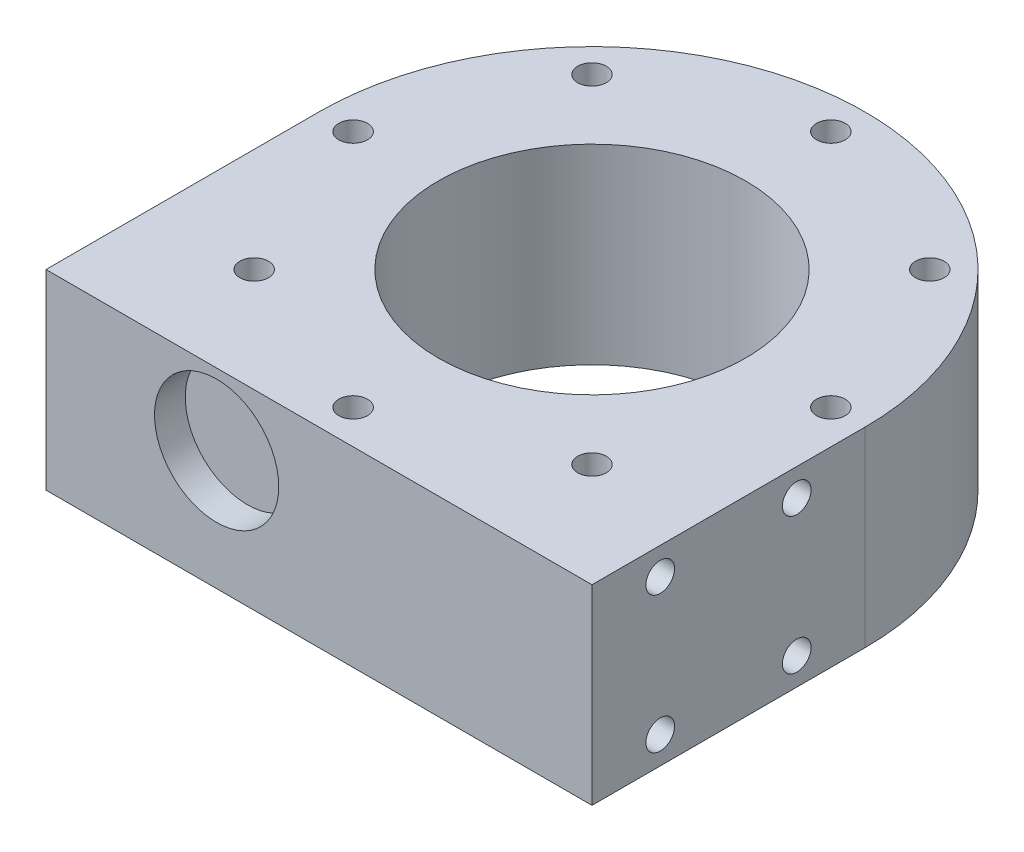
ISO-10303-21;
HEADER;
FILE_DESCRIPTION(('STEP AP214'),'2;1');
FILE_NAME('part.step','',(''),(''),'','','');
FILE_SCHEMA(('AUTOMOTIVE_DESIGN { 1 0 10303 214 1 1 1 1 }'));
ENDSEC;
DATA;
#1=APPLICATION_CONTEXT('core data for automotive mechanical design processes');
#2=APPLICATION_PROTOCOL_DEFINITION('international standard','automotive_design',2000,#1);
#3=PRODUCT_CONTEXT('',#1,'mechanical');
#4=PRODUCT('Part','Part','',(#3));
#5=PRODUCT_RELATED_PRODUCT_CATEGORY('part','',(#4));
#6=PRODUCT_DEFINITION_FORMATION('','',#4);
#7=PRODUCT_DEFINITION_CONTEXT('part definition',#1,'design');
#8=PRODUCT_DEFINITION('design','',#6,#7);
#9=PRODUCT_DEFINITION_SHAPE('','',#8);
#10=(LENGTH_UNIT() NAMED_UNIT(*) SI_UNIT(.MILLI.,.METRE.));
#11=(NAMED_UNIT(*) PLANE_ANGLE_UNIT() SI_UNIT($,.RADIAN.));
#12=(NAMED_UNIT(*) SI_UNIT($,.STERADIAN.) SOLID_ANGLE_UNIT());
#13=UNCERTAINTY_MEASURE_WITH_UNIT(LENGTH_MEASURE(1.E-05),#10,'distance_accuracy_value','');
#14=(GEOMETRIC_REPRESENTATION_CONTEXT(3) GLOBAL_UNCERTAINTY_ASSIGNED_CONTEXT((#13)) GLOBAL_UNIT_ASSIGNED_CONTEXT((#10,
#11,#12)) REPRESENTATION_CONTEXT('',''));
#15=CARTESIAN_POINT('',(0.,0.,0.));
#16=DIRECTION('',(0.,0.,1.));
#17=DIRECTION('',(1.,0.,0.));
#18=AXIS2_PLACEMENT_3D('',#15,#16,#17);
#19=CARTESIAN_POINT('',(0.,28.,0.));
#20=DIRECTION('',(0.,1.,0.));
#21=DIRECTION('',(0.,0.,1.));
#22=AXIS2_PLACEMENT_3D('',#19,#20,#21);
#23=PLANE('',#22);
#24=CARTESIAN_POINT('',(0.,28.,-35.));
#25=DIRECTION('',(0.,1.,0.));
#26=DIRECTION('',(0.,0.,1.));
#27=AXIS2_PLACEMENT_3D('',#24,#25,#26);
#28=CIRCLE('',#27,2.1);
#29=CARTESIAN_POINT('',(0.,28.,-32.9));
#30=VERTEX_POINT('',#29);
#31=EDGE_CURVE('E198',#30,#30,#28,.T.);
#32=ORIENTED_EDGE('',*,*,#31,.F.);
#33=EDGE_LOOP('',(#32));
#34=FACE_BOUND('',#33,.T.);
#35=CARTESIAN_POINT('',(24.7487373415292,28.,-24.7487373415292));
#36=DIRECTION('',(0.,1.,0.));
#37=DIRECTION('',(0.,0.,1.));
#38=AXIS2_PLACEMENT_3D('',#35,#36,#37);
#39=CIRCLE('',#38,2.1);
#40=CARTESIAN_POINT('',(24.7487373415292,28.,-22.6487373415292));
#41=VERTEX_POINT('',#40);
#42=EDGE_CURVE('E194',#41,#41,#39,.T.);
#43=ORIENTED_EDGE('',*,*,#42,.F.);
#44=EDGE_LOOP('',(#43));
#45=FACE_BOUND('',#44,.T.);
#46=CARTESIAN_POINT('',(35.,28.,0.));
#47=DIRECTION('',(0.,1.,0.));
#48=DIRECTION('',(0.,0.,1.));
#49=AXIS2_PLACEMENT_3D('',#46,#47,#48);
#50=CIRCLE('',#49,2.1);
#51=CARTESIAN_POINT('',(35.,28.,2.1));
#52=VERTEX_POINT('',#51);
#53=EDGE_CURVE('E186',#52,#52,#50,.T.);
#54=ORIENTED_EDGE('',*,*,#53,.F.);
#55=EDGE_LOOP('',(#54));
#56=FACE_BOUND('',#55,.T.);
#57=CARTESIAN_POINT('',(24.7487373415292,28.,24.7487373415292));
#58=DIRECTION('',(0.,1.,0.));
#59=DIRECTION('',(0.,0.,1.));
#60=AXIS2_PLACEMENT_3D('',#57,#58,#59);
#61=CIRCLE('',#60,2.1);
#62=CARTESIAN_POINT('',(24.7487373415292,28.,26.8487373415292));
#63=VERTEX_POINT('',#62);
#64=EDGE_CURVE('E178',#63,#63,#61,.T.);
#65=ORIENTED_EDGE('',*,*,#64,.F.);
#66=EDGE_LOOP('',(#65));
#67=FACE_BOUND('',#66,.T.);
#68=CARTESIAN_POINT('',(0.,28.,35.));
#69=DIRECTION('',(0.,1.,0.));
#70=DIRECTION('',(0.,0.,1.));
#71=AXIS2_PLACEMENT_3D('',#68,#69,#70);
#72=CIRCLE('',#71,2.1);
#73=CARTESIAN_POINT('',(0.,28.,37.1));
#74=VERTEX_POINT('',#73);
#75=EDGE_CURVE('E170',#74,#74,#72,.T.);
#76=ORIENTED_EDGE('',*,*,#75,.F.);
#77=EDGE_LOOP('',(#76));
#78=FACE_BOUND('',#77,.T.);
#79=CARTESIAN_POINT('',(-24.7487373415292,28.,24.7487373415292));
#80=DIRECTION('',(0.,1.,0.));
#81=DIRECTION('',(0.,0.,1.));
#82=AXIS2_PLACEMENT_3D('',#79,#80,#81);
#83=CIRCLE('',#82,2.1);
#84=CARTESIAN_POINT('',(-24.7487373415292,28.,26.8487373415292));
#85=VERTEX_POINT('',#84);
#86=EDGE_CURVE('E162',#85,#85,#83,.T.);
#87=ORIENTED_EDGE('',*,*,#86,.F.);
#88=EDGE_LOOP('',(#87));
#89=FACE_BOUND('',#88,.T.);
#90=CARTESIAN_POINT('',(-35.,28.,0.));
#91=DIRECTION('',(0.,1.,0.));
#92=DIRECTION('',(0.,0.,1.));
#93=AXIS2_PLACEMENT_3D('',#90,#91,#92);
#94=CIRCLE('',#93,2.1);
#95=CARTESIAN_POINT('',(-35.,28.,2.1));
#96=VERTEX_POINT('',#95);
#97=EDGE_CURVE('E154',#96,#96,#94,.T.);
#98=ORIENTED_EDGE('',*,*,#97,.F.);
#99=EDGE_LOOP('',(#98));
#100=FACE_BOUND('',#99,.T.);
#101=CARTESIAN_POINT('',(-24.7487373415292,28.,-24.7487373415292));
#102=DIRECTION('',(0.,1.,0.));
#103=DIRECTION('',(0.,0.,1.));
#104=AXIS2_PLACEMENT_3D('',#101,#102,#103);
#105=CIRCLE('',#104,2.1);
#106=CARTESIAN_POINT('',(-24.7487373415292,28.,-22.6487373415292));
#107=VERTEX_POINT('',#106);
#108=EDGE_CURVE('E145',#107,#107,#105,.T.);
#109=ORIENTED_EDGE('',*,*,#108,.F.);
#110=EDGE_LOOP('',(#109));
#111=FACE_BOUND('',#110,.T.);
#112=CARTESIAN_POINT('',(0.,28.,0.));
#113=DIRECTION('',(0.,1.,0.));
#114=DIRECTION('',(0.,0.,1.));
#115=AXIS2_PLACEMENT_3D('',#112,#113,#114);
#116=CIRCLE('',#115,40.);
#117=CARTESIAN_POINT('',(40.,28.,0.));
#118=VERTEX_POINT('',#117);
#119=CARTESIAN_POINT('',(-40.,28.,0.));
#120=VERTEX_POINT('',#119);
#121=EDGE_CURVE('E95',#118,#120,#116,.T.);
#122=ORIENTED_EDGE('',*,*,#121,.T.);
#123=DIRECTION('',(0.,0.,1.));
#124=VECTOR('',#123,1.);
#125=CARTESIAN_POINT('',(-40.,28.,0.));
#126=LINE('',#125,#124);
#127=CARTESIAN_POINT('',(-40.,28.,40.));
#128=VERTEX_POINT('',#127);
#129=EDGE_CURVE('E90',#120,#128,#126,.T.);
#130=ORIENTED_EDGE('',*,*,#129,.T.);
#131=DIRECTION('',(1.,0.,0.));
#132=VECTOR('',#131,1.);
#133=CARTESIAN_POINT('',(-40.,28.,40.));
#134=LINE('',#133,#132);
#135=CARTESIAN_POINT('',(40.,28.,40.));
#136=VERTEX_POINT('',#135);
#137=EDGE_CURVE('E93',#128,#136,#134,.T.);
#138=ORIENTED_EDGE('',*,*,#137,.T.);
#139=DIRECTION('',(0.,0.,-1.));
#140=VECTOR('',#139,1.);
#141=CARTESIAN_POINT('',(40.,28.,0.));
#142=LINE('',#141,#140);
#143=EDGE_CURVE('E60',#136,#118,#142,.T.);
#144=ORIENTED_EDGE('',*,*,#143,.T.);
#145=EDGE_LOOP('',(#122,#130,#138,#144));
#146=FACE_BOUND('',#145,.T.);
#147=CARTESIAN_POINT('',(0.,28.,0.));
#148=DIRECTION('',(0.,1.,0.));
#149=DIRECTION('',(0.,0.,1.));
#150=AXIS2_PLACEMENT_3D('',#147,#148,#149);
#151=CIRCLE('',#150,22.5);
#152=CARTESIAN_POINT('',(0.,28.,22.5));
#153=VERTEX_POINT('',#152);
#154=EDGE_CURVE('E115',#153,#153,#151,.T.);
#155=ORIENTED_EDGE('',*,*,#154,.F.);
#156=EDGE_LOOP('',(#155));
#157=FACE_BOUND('',#156,.T.);
#158=ADVANCED_FACE('F42',(#34,#45,#56,#67,#78,#89,#100,#111,#146,#157),#23,.T.);
#159=CARTESIAN_POINT('',(0.,0.,0.));
#160=DIRECTION('',(0.,1.,0.));
#161=DIRECTION('',(0.,0.,1.));
#162=AXIS2_PLACEMENT_3D('',#159,#160,#161);
#163=PLANE('',#162);
#164=CARTESIAN_POINT('',(0.,0.,-35.));
#165=DIRECTION('',(0.,1.,0.));
#166=DIRECTION('',(0.,0.,1.));
#167=AXIS2_PLACEMENT_3D('',#164,#165,#166);
#168=CIRCLE('',#167,2.1);
#169=CARTESIAN_POINT('',(0.,0.,-32.9));
#170=VERTEX_POINT('',#169);
#171=EDGE_CURVE('E137',#170,#170,#168,.T.);
#172=ORIENTED_EDGE('',*,*,#171,.T.);
#173=EDGE_LOOP('',(#172));
#174=FACE_BOUND('',#173,.T.);
#175=CARTESIAN_POINT('',(24.7487373415292,0.,-24.7487373415292));
#176=DIRECTION('',(0.,1.,0.));
#177=DIRECTION('',(0.,0.,1.));
#178=AXIS2_PLACEMENT_3D('',#175,#176,#177);
#179=CIRCLE('',#178,2.1);
#180=CARTESIAN_POINT('',(24.7487373415292,0.,-22.6487373415292));
#181=VERTEX_POINT('',#180);
#182=EDGE_CURVE('E190',#181,#181,#179,.T.);
#183=ORIENTED_EDGE('',*,*,#182,.T.);
#184=EDGE_LOOP('',(#183));
#185=FACE_BOUND('',#184,.T.);
#186=CARTESIAN_POINT('',(35.,0.,0.));
#187=DIRECTION('',(0.,1.,0.));
#188=DIRECTION('',(0.,0.,1.));
#189=AXIS2_PLACEMENT_3D('',#186,#187,#188);
#190=CIRCLE('',#189,2.1);
#191=CARTESIAN_POINT('',(35.,0.,2.1));
#192=VERTEX_POINT('',#191);
#193=EDGE_CURVE('E182',#192,#192,#190,.T.);
#194=ORIENTED_EDGE('',*,*,#193,.T.);
#195=EDGE_LOOP('',(#194));
#196=FACE_BOUND('',#195,.T.);
#197=CARTESIAN_POINT('',(24.7487373415292,0.,24.7487373415292));
#198=DIRECTION('',(0.,1.,0.));
#199=DIRECTION('',(0.,0.,1.));
#200=AXIS2_PLACEMENT_3D('',#197,#198,#199);
#201=CIRCLE('',#200,2.1);
#202=CARTESIAN_POINT('',(24.7487373415292,0.,26.8487373415292));
#203=VERTEX_POINT('',#202);
#204=EDGE_CURVE('E174',#203,#203,#201,.T.);
#205=ORIENTED_EDGE('',*,*,#204,.T.);
#206=EDGE_LOOP('',(#205));
#207=FACE_BOUND('',#206,.T.);
#208=CARTESIAN_POINT('',(0.,0.,35.));
#209=DIRECTION('',(0.,1.,0.));
#210=DIRECTION('',(0.,0.,1.));
#211=AXIS2_PLACEMENT_3D('',#208,#209,#210);
#212=CIRCLE('',#211,2.1);
#213=CARTESIAN_POINT('',(0.,0.,37.1));
#214=VERTEX_POINT('',#213);
#215=EDGE_CURVE('E166',#214,#214,#212,.T.);
#216=ORIENTED_EDGE('',*,*,#215,.T.);
#217=EDGE_LOOP('',(#216));
#218=FACE_BOUND('',#217,.T.);
#219=CARTESIAN_POINT('',(-24.7487373415292,0.,24.7487373415292));
#220=DIRECTION('',(0.,1.,0.));
#221=DIRECTION('',(0.,0.,1.));
#222=AXIS2_PLACEMENT_3D('',#219,#220,#221);
#223=CIRCLE('',#222,2.1);
#224=CARTESIAN_POINT('',(-24.7487373415292,0.,26.8487373415292));
#225=VERTEX_POINT('',#224);
#226=EDGE_CURVE('E158',#225,#225,#223,.T.);
#227=ORIENTED_EDGE('',*,*,#226,.T.);
#228=EDGE_LOOP('',(#227));
#229=FACE_BOUND('',#228,.T.);
#230=CARTESIAN_POINT('',(-35.,0.,0.));
#231=DIRECTION('',(0.,1.,0.));
#232=DIRECTION('',(0.,0.,1.));
#233=AXIS2_PLACEMENT_3D('',#230,#231,#232);
#234=CIRCLE('',#233,2.1);
#235=CARTESIAN_POINT('',(-35.,0.,2.1));
#236=VERTEX_POINT('',#235);
#237=EDGE_CURVE('E150',#236,#236,#234,.T.);
#238=ORIENTED_EDGE('',*,*,#237,.T.);
#239=EDGE_LOOP('',(#238));
#240=FACE_BOUND('',#239,.T.);
#241=CARTESIAN_POINT('',(-24.7487373415292,0.,-24.7487373415292));
#242=DIRECTION('',(0.,1.,0.));
#243=DIRECTION('',(0.,0.,1.));
#244=AXIS2_PLACEMENT_3D('',#241,#242,#243);
#245=CIRCLE('',#244,2.1);
#246=CARTESIAN_POINT('',(-24.7487373415292,0.,-22.6487373415292));
#247=VERTEX_POINT('',#246);
#248=EDGE_CURVE('E141',#247,#247,#245,.T.);
#249=ORIENTED_EDGE('',*,*,#248,.T.);
#250=EDGE_LOOP('',(#249));
#251=FACE_BOUND('',#250,.T.);
#252=CARTESIAN_POINT('',(0.,0.,0.));
#253=DIRECTION('',(0.,1.,0.));
#254=DIRECTION('',(0.,0.,1.));
#255=AXIS2_PLACEMENT_3D('',#252,#253,#254);
#256=CIRCLE('',#255,40.);
#257=CARTESIAN_POINT('',(40.,0.,0.));
#258=VERTEX_POINT('',#257);
#259=CARTESIAN_POINT('',(-40.,0.,0.));
#260=VERTEX_POINT('',#259);
#261=EDGE_CURVE('E111',#258,#260,#256,.T.);
#262=ORIENTED_EDGE('',*,*,#261,.F.);
#263=DIRECTION('',(0.,0.,-1.));
#264=VECTOR('',#263,1.);
#265=CARTESIAN_POINT('',(40.,0.,0.));
#266=LINE('',#265,#264);
#267=CARTESIAN_POINT('',(40.,0.,40.));
#268=VERTEX_POINT('',#267);
#269=EDGE_CURVE('E83',#268,#258,#266,.T.);
#270=ORIENTED_EDGE('',*,*,#269,.F.);
#271=DIRECTION('',(1.,0.,0.));
#272=VECTOR('',#271,1.);
#273=CARTESIAN_POINT('',(-40.,0.,40.));
#274=LINE('',#273,#272);
#275=CARTESIAN_POINT('',(-40.,0.,40.));
#276=VERTEX_POINT('',#275);
#277=EDGE_CURVE('E77',#276,#268,#274,.T.);
#278=ORIENTED_EDGE('',*,*,#277,.F.);
#279=DIRECTION('',(0.,0.,1.));
#280=VECTOR('',#279,1.);
#281=CARTESIAN_POINT('',(-40.,0.,0.));
#282=LINE('',#281,#280);
#283=EDGE_CURVE('E100',#260,#276,#282,.T.);
#284=ORIENTED_EDGE('',*,*,#283,.F.);
#285=EDGE_LOOP('',(#262,#270,#278,#284));
#286=FACE_BOUND('',#285,.T.);
#287=CARTESIAN_POINT('',(0.,0.,0.));
#288=DIRECTION('',(0.,1.,0.));
#289=DIRECTION('',(0.,0.,1.));
#290=AXIS2_PLACEMENT_3D('',#287,#288,#289);
#291=CIRCLE('',#290,22.5);
#292=CARTESIAN_POINT('',(0.,0.,22.5));
#293=VERTEX_POINT('',#292);
#294=EDGE_CURVE('E133',#293,#293,#291,.T.);
#295=ORIENTED_EDGE('',*,*,#294,.T.);
#296=EDGE_LOOP('',(#295));
#297=FACE_BOUND('',#296,.T.);
#298=ADVANCED_FACE('F128',(#174,#185,#196,#207,#218,#229,#240,#251,#286,#297),#163,.F.);
#299=CARTESIAN_POINT('',(0.,28.,0.));
#300=DIRECTION('',(0.,-1.,0.));
#301=DIRECTION('',(0.,0.,-1.));
#302=AXIS2_PLACEMENT_3D('',#299,#300,#301);
#303=CYLINDRICAL_SURFACE('',#302,40.);
#304=ORIENTED_EDGE('',*,*,#261,.T.);
#305=DIRECTION('',(0.,-1.,0.));
#306=VECTOR('',#305,1.);
#307=CARTESIAN_POINT('',(-40.,28.,0.));
#308=LINE('',#307,#306);
#309=EDGE_CURVE('E11',#120,#260,#308,.T.);
#310=ORIENTED_EDGE('',*,*,#309,.F.);
#311=ORIENTED_EDGE('',*,*,#121,.F.);
#312=DIRECTION('',(0.,-1.,0.));
#313=VECTOR('',#312,1.);
#314=CARTESIAN_POINT('',(40.,28.,0.));
#315=LINE('',#314,#313);
#316=EDGE_CURVE('E107',#118,#258,#315,.T.);
#317=ORIENTED_EDGE('',*,*,#316,.T.);
#318=EDGE_LOOP('',(#304,#310,#311,#317));
#319=FACE_BOUND('',#318,.T.);
#320=ADVANCED_FACE('F44',(#319),#303,.T.);
#321=CARTESIAN_POINT('',(-40.,28.,0.));
#322=DIRECTION('',(1.,0.,0.));
#323=DIRECTION('',(0.,0.,-1.));
#324=AXIS2_PLACEMENT_3D('',#321,#322,#323);
#325=PLANE('',#324);
#326=CARTESIAN_POINT('',(-40.,24.,30.));
#327=DIRECTION('',(-1.,0.,0.));
#328=DIRECTION('',(0.,0.,1.));
#329=AXIS2_PLACEMENT_3D('',#326,#327,#328);
#330=CIRCLE('',#329,2.1);
#331=CARTESIAN_POINT('',(-40.,24.,32.1));
#332=VERTEX_POINT('',#331);
#333=EDGE_CURVE('E217',#332,#332,#330,.T.);
#334=ORIENTED_EDGE('',*,*,#333,.F.);
#335=EDGE_LOOP('',(#334));
#336=FACE_BOUND('',#335,.T.);
#337=CARTESIAN_POINT('',(-40.,4.,10.));
#338=DIRECTION('',(-1.,0.,0.));
#339=DIRECTION('',(0.,0.,1.));
#340=AXIS2_PLACEMENT_3D('',#337,#338,#339);
#341=CIRCLE('',#340,2.1);
#342=CARTESIAN_POINT('',(-40.,4.,12.1));
#343=VERTEX_POINT('',#342);
#344=EDGE_CURVE('E225',#343,#343,#341,.T.);
#345=ORIENTED_EDGE('',*,*,#344,.F.);
#346=EDGE_LOOP('',(#345));
#347=FACE_BOUND('',#346,.T.);
#348=CARTESIAN_POINT('',(-40.,4.,30.));
#349=DIRECTION('',(-1.,0.,0.));
#350=DIRECTION('',(0.,0.,1.));
#351=AXIS2_PLACEMENT_3D('',#348,#349,#350);
#352=CIRCLE('',#351,2.1);
#353=CARTESIAN_POINT('',(-40.,4.,32.1));
#354=VERTEX_POINT('',#353);
#355=EDGE_CURVE('E226',#354,#354,#352,.T.);
#356=ORIENTED_EDGE('',*,*,#355,.F.);
#357=EDGE_LOOP('',(#356));
#358=FACE_BOUND('',#357,.T.);
#359=CARTESIAN_POINT('',(-40.,24.,9.99999999999999));
#360=DIRECTION('',(-1.,0.,0.));
#361=DIRECTION('',(0.,0.,1.));
#362=AXIS2_PLACEMENT_3D('',#359,#360,#361);
#363=CIRCLE('',#362,2.1);
#364=CARTESIAN_POINT('',(-40.,24.,12.1));
#365=VERTEX_POINT('',#364);
#366=EDGE_CURVE('E213',#365,#365,#363,.T.);
#367=ORIENTED_EDGE('',*,*,#366,.F.);
#368=EDGE_LOOP('',(#367));
#369=FACE_BOUND('',#368,.T.);
#370=ORIENTED_EDGE('',*,*,#283,.T.);
#371=DIRECTION('',(0.,-1.,0.));
#372=VECTOR('',#371,1.);
#373=CARTESIAN_POINT('',(-40.,28.,40.));
#374=LINE('',#373,#372);
#375=EDGE_CURVE('E52',#128,#276,#374,.T.);
#376=ORIENTED_EDGE('',*,*,#375,.F.);
#377=ORIENTED_EDGE('',*,*,#129,.F.);
#378=ORIENTED_EDGE('',*,*,#309,.T.);
#379=EDGE_LOOP('',(#370,#376,#377,#378));
#380=FACE_BOUND('',#379,.T.);
#381=ADVANCED_FACE('F99',(#336,#347,#358,#369,#380),#325,.F.);
#382=CARTESIAN_POINT('',(-40.,28.,40.));
#383=DIRECTION('',(0.,0.,-1.));
#384=DIRECTION('',(-1.,0.,0.));
#385=AXIS2_PLACEMENT_3D('',#382,#383,#384);
#386=PLANE('',#385);
#387=CARTESIAN_POINT('',(-15.,17.5,40.));
#388=DIRECTION('',(0.,0.,1.));
#389=DIRECTION('',(1.,0.,0.));
#390=AXIS2_PLACEMENT_3D('',#387,#388,#389);
#391=CIRCLE('',#390,9.1);
#392=CARTESIAN_POINT('',(-5.89999999999999,17.5,40.));
#393=VERTEX_POINT('',#392);
#394=EDGE_CURVE('E205',#393,#393,#391,.T.);
#395=ORIENTED_EDGE('',*,*,#394,.F.);
#396=EDGE_LOOP('',(#395));
#397=FACE_BOUND('',#396,.T.);
#398=ORIENTED_EDGE('',*,*,#277,.T.);
#399=DIRECTION('',(0.,-1.,0.));
#400=VECTOR('',#399,1.);
#401=CARTESIAN_POINT('',(40.,28.,40.));
#402=LINE('',#401,#400);
#403=EDGE_CURVE('E102',#136,#268,#402,.T.);
#404=ORIENTED_EDGE('',*,*,#403,.F.);
#405=ORIENTED_EDGE('',*,*,#137,.F.);
#406=ORIENTED_EDGE('',*,*,#375,.T.);
#407=EDGE_LOOP('',(#398,#404,#405,#406));
#408=FACE_BOUND('',#407,.T.);
#409=ADVANCED_FACE('F103',(#397,#408),#386,.F.);
#410=CARTESIAN_POINT('',(40.,28.,0.));
#411=DIRECTION('',(-1.,0.,0.));
#412=DIRECTION('',(0.,0.,1.));
#413=AXIS2_PLACEMENT_3D('',#410,#411,#412);
#414=PLANE('',#413);
#415=CARTESIAN_POINT('',(40.,24.,30.));
#416=DIRECTION('',(-1.,0.,0.));
#417=DIRECTION('',(0.,0.,1.));
#418=AXIS2_PLACEMENT_3D('',#415,#416,#417);
#419=CIRCLE('',#418,2.1);
#420=CARTESIAN_POINT('',(40.,24.,32.1));
#421=VERTEX_POINT('',#420);
#422=EDGE_CURVE('E262',#421,#421,#419,.T.);
#423=ORIENTED_EDGE('',*,*,#422,.T.);
#424=EDGE_LOOP('',(#423));
#425=FACE_BOUND('',#424,.T.);
#426=CARTESIAN_POINT('',(40.,4.,10.));
#427=DIRECTION('',(-1.,0.,0.));
#428=DIRECTION('',(0.,0.,1.));
#429=AXIS2_PLACEMENT_3D('',#426,#427,#428);
#430=CIRCLE('',#429,2.1);
#431=CARTESIAN_POINT('',(40.,4.,12.1));
#432=VERTEX_POINT('',#431);
#433=EDGE_CURVE('E253',#432,#432,#430,.T.);
#434=ORIENTED_EDGE('',*,*,#433,.T.);
#435=EDGE_LOOP('',(#434));
#436=FACE_BOUND('',#435,.T.);
#437=CARTESIAN_POINT('',(40.,4.,30.));
#438=DIRECTION('',(-1.,0.,0.));
#439=DIRECTION('',(0.,0.,1.));
#440=AXIS2_PLACEMENT_3D('',#437,#438,#439);
#441=CIRCLE('',#440,2.1);
#442=CARTESIAN_POINT('',(40.,4.,32.1));
#443=VERTEX_POINT('',#442);
#444=EDGE_CURVE('E269',#443,#443,#441,.T.);
#445=ORIENTED_EDGE('',*,*,#444,.T.);
#446=EDGE_LOOP('',(#445));
#447=FACE_BOUND('',#446,.T.);
#448=CARTESIAN_POINT('',(40.,24.,9.99999999999999));
#449=DIRECTION('',(-1.,0.,0.));
#450=DIRECTION('',(0.,0.,1.));
#451=AXIS2_PLACEMENT_3D('',#448,#449,#450);
#452=CIRCLE('',#451,2.1);
#453=CARTESIAN_POINT('',(40.,24.,12.1));
#454=VERTEX_POINT('',#453);
#455=EDGE_CURVE('E245',#454,#454,#452,.T.);
#456=ORIENTED_EDGE('',*,*,#455,.T.);
#457=EDGE_LOOP('',(#456));
#458=FACE_BOUND('',#457,.T.);
#459=ORIENTED_EDGE('',*,*,#269,.T.);
#460=ORIENTED_EDGE('',*,*,#316,.F.);
#461=ORIENTED_EDGE('',*,*,#143,.F.);
#462=ORIENTED_EDGE('',*,*,#403,.T.);
#463=EDGE_LOOP('',(#459,#460,#461,#462));
#464=FACE_BOUND('',#463,.T.);
#465=ADVANCED_FACE('F125',(#425,#436,#447,#458,#464),#414,.F.);
#466=CARTESIAN_POINT('',(0.,28.,0.));
#467=DIRECTION('',(0.,-1.,0.));
#468=DIRECTION('',(0.,0.,-1.));
#469=AXIS2_PLACEMENT_3D('',#466,#467,#468);
#470=CYLINDRICAL_SURFACE('',#469,22.5);
#471=ORIENTED_EDGE('',*,*,#154,.T.);
#472=EDGE_LOOP('',(#471));
#473=FACE_BOUND('',#472,.T.);
#474=ORIENTED_EDGE('',*,*,#294,.F.);
#475=EDGE_LOOP('',(#474));
#476=FACE_BOUND('',#475,.T.);
#477=ADVANCED_FACE('F304',(#473,#476),#470,.F.);
#478=CARTESIAN_POINT('',(-24.7487373415292,0.,-24.7487373415292));
#479=DIRECTION('',(0.,1.,0.));
#480=DIRECTION('',(0.,0.,1.));
#481=AXIS2_PLACEMENT_3D('',#478,#479,#480);
#482=CYLINDRICAL_SURFACE('',#481,2.1);
#483=ORIENTED_EDGE('',*,*,#248,.F.);
#484=EDGE_LOOP('',(#483));
#485=FACE_BOUND('',#484,.T.);
#486=ORIENTED_EDGE('',*,*,#108,.T.);
#487=EDGE_LOOP('',(#486));
#488=FACE_BOUND('',#487,.T.);
#489=ADVANCED_FACE('F374',(#485,#488),#482,.F.);
#490=CARTESIAN_POINT('',(-35.,0.,0.));
#491=DIRECTION('',(0.,1.,0.));
#492=DIRECTION('',(0.,0.,1.));
#493=AXIS2_PLACEMENT_3D('',#490,#491,#492);
#494=CYLINDRICAL_SURFACE('',#493,2.1);
#495=ORIENTED_EDGE('',*,*,#237,.F.);
#496=EDGE_LOOP('',(#495));
#497=FACE_BOUND('',#496,.T.);
#498=ORIENTED_EDGE('',*,*,#97,.T.);
#499=EDGE_LOOP('',(#498));
#500=FACE_BOUND('',#499,.T.);
#501=ADVANCED_FACE('F371',(#497,#500),#494,.F.);
#502=CARTESIAN_POINT('',(-24.7487373415292,0.,24.7487373415292));
#503=DIRECTION('',(0.,1.,0.));
#504=DIRECTION('',(0.,0.,1.));
#505=AXIS2_PLACEMENT_3D('',#502,#503,#504);
#506=CYLINDRICAL_SURFACE('',#505,2.1);
#507=ORIENTED_EDGE('',*,*,#226,.F.);
#508=EDGE_LOOP('',(#507));
#509=FACE_BOUND('',#508,.T.);
#510=ORIENTED_EDGE('',*,*,#86,.T.);
#511=EDGE_LOOP('',(#510));
#512=FACE_BOUND('',#511,.T.);
#513=ADVANCED_FACE('F367',(#509,#512),#506,.F.);
#514=CARTESIAN_POINT('',(0.,0.,35.));
#515=DIRECTION('',(0.,1.,0.));
#516=DIRECTION('',(0.,0.,1.));
#517=AXIS2_PLACEMENT_3D('',#514,#515,#516);
#518=CYLINDRICAL_SURFACE('',#517,2.1);
#519=ORIENTED_EDGE('',*,*,#215,.F.);
#520=EDGE_LOOP('',(#519));
#521=FACE_BOUND('',#520,.T.);
#522=ORIENTED_EDGE('',*,*,#75,.T.);
#523=EDGE_LOOP('',(#522));
#524=FACE_BOUND('',#523,.T.);
#525=ADVANCED_FACE('F363',(#521,#524),#518,.F.);
#526=CARTESIAN_POINT('',(24.7487373415292,0.,24.7487373415292));
#527=DIRECTION('',(0.,1.,0.));
#528=DIRECTION('',(0.,0.,1.));
#529=AXIS2_PLACEMENT_3D('',#526,#527,#528);
#530=CYLINDRICAL_SURFACE('',#529,2.1);
#531=ORIENTED_EDGE('',*,*,#204,.F.);
#532=EDGE_LOOP('',(#531));
#533=FACE_BOUND('',#532,.T.);
#534=ORIENTED_EDGE('',*,*,#64,.T.);
#535=EDGE_LOOP('',(#534));
#536=FACE_BOUND('',#535,.T.);
#537=ADVANCED_FACE('F359',(#533,#536),#530,.F.);
#538=CARTESIAN_POINT('',(35.,0.,0.));
#539=DIRECTION('',(0.,1.,0.));
#540=DIRECTION('',(0.,0.,1.));
#541=AXIS2_PLACEMENT_3D('',#538,#539,#540);
#542=CYLINDRICAL_SURFACE('',#541,2.1);
#543=ORIENTED_EDGE('',*,*,#193,.F.);
#544=EDGE_LOOP('',(#543));
#545=FACE_BOUND('',#544,.T.);
#546=ORIENTED_EDGE('',*,*,#53,.T.);
#547=EDGE_LOOP('',(#546));
#548=FACE_BOUND('',#547,.T.);
#549=ADVANCED_FACE('F355',(#545,#548),#542,.F.);
#550=CARTESIAN_POINT('',(24.7487373415292,0.,-24.7487373415292));
#551=DIRECTION('',(0.,1.,0.));
#552=DIRECTION('',(0.,0.,1.));
#553=AXIS2_PLACEMENT_3D('',#550,#551,#552);
#554=CYLINDRICAL_SURFACE('',#553,2.1);
#555=ORIENTED_EDGE('',*,*,#182,.F.);
#556=EDGE_LOOP('',(#555));
#557=FACE_BOUND('',#556,.T.);
#558=ORIENTED_EDGE('',*,*,#42,.T.);
#559=EDGE_LOOP('',(#558));
#560=FACE_BOUND('',#559,.T.);
#561=ADVANCED_FACE('F351',(#557,#560),#554,.F.);
#562=CARTESIAN_POINT('',(0.,0.,-35.));
#563=DIRECTION('',(0.,1.,0.));
#564=DIRECTION('',(0.,0.,1.));
#565=AXIS2_PLACEMENT_3D('',#562,#563,#564);
#566=CYLINDRICAL_SURFACE('',#565,2.1);
#567=ORIENTED_EDGE('',*,*,#171,.F.);
#568=EDGE_LOOP('',(#567));
#569=FACE_BOUND('',#568,.T.);
#570=ORIENTED_EDGE('',*,*,#31,.T.);
#571=EDGE_LOOP('',(#570));
#572=FACE_BOUND('',#571,.T.);
#573=ADVANCED_FACE('F347',(#569,#572),#566,.F.);
#574=CARTESIAN_POINT('',(-15.,17.5,35.5));
#575=DIRECTION('',(0.,0.,1.));
#576=DIRECTION('',(1.,0.,0.));
#577=AXIS2_PLACEMENT_3D('',#574,#575,#576);
#578=CYLINDRICAL_SURFACE('',#577,9.1);
#579=CARTESIAN_POINT('',(-15.,17.5,35.5));
#580=DIRECTION('',(0.,0.,1.));
#581=DIRECTION('',(1.,0.,0.));
#582=AXIS2_PLACEMENT_3D('',#579,#580,#581);
#583=CIRCLE('',#582,9.1);
#584=CARTESIAN_POINT('',(-5.89999999999999,17.5,35.5));
#585=VERTEX_POINT('',#584);
#586=EDGE_CURVE('E146',#585,#585,#583,.T.);
#587=ORIENTED_EDGE('',*,*,#586,.F.);
#588=EDGE_LOOP('',(#587));
#589=FACE_BOUND('',#588,.T.);
#590=ORIENTED_EDGE('',*,*,#394,.T.);
#591=EDGE_LOOP('',(#590));
#592=FACE_BOUND('',#591,.T.);
#593=ADVANCED_FACE('F339',(#589,#592),#578,.F.);
#594=CARTESIAN_POINT('',(-15.,17.5,35.5));
#595=DIRECTION('',(0.,0.,1.));
#596=DIRECTION('',(1.,0.,0.));
#597=AXIS2_PLACEMENT_3D('',#594,#595,#596);
#598=PLANE('',#597);
#599=ORIENTED_EDGE('',*,*,#586,.T.);
#600=EDGE_LOOP('',(#599));
#601=FACE_BOUND('',#600,.T.);
#602=ADVANCED_FACE('F330',(#601),#598,.T.);
#603=CARTESIAN_POINT('',(-36.,24.,9.99999999999999));
#604=DIRECTION('',(-1.,0.,0.));
#605=DIRECTION('',(0.,0.,1.));
#606=AXIS2_PLACEMENT_3D('',#603,#604,#605);
#607=CYLINDRICAL_SURFACE('',#606,2.1);
#608=CARTESIAN_POINT('',(-36.,24.,9.99999999999999));
#609=DIRECTION('',(-1.,0.,0.));
#610=DIRECTION('',(0.,0.,1.));
#611=AXIS2_PLACEMENT_3D('',#608,#609,#610);
#612=CIRCLE('',#611,2.1);
#613=CARTESIAN_POINT('',(-36.,24.,12.1));
#614=VERTEX_POINT('',#613);
#615=EDGE_CURVE('E209',#614,#614,#612,.T.);
#616=ORIENTED_EDGE('',*,*,#615,.F.);
#617=EDGE_LOOP('',(#616));
#618=FACE_BOUND('',#617,.T.);
#619=ORIENTED_EDGE('',*,*,#366,.T.);
#620=EDGE_LOOP('',(#619));
#621=FACE_BOUND('',#620,.T.);
#622=ADVANCED_FACE('F327',(#618,#621),#607,.F.);
#623=CARTESIAN_POINT('',(-36.,24.,9.99999999999999));
#624=DIRECTION('',(-1.,0.,0.));
#625=DIRECTION('',(0.,0.,1.));
#626=AXIS2_PLACEMENT_3D('',#623,#624,#625);
#627=PLANE('',#626);
#628=ORIENTED_EDGE('',*,*,#615,.T.);
#629=EDGE_LOOP('',(#628));
#630=FACE_BOUND('',#629,.T.);
#631=ADVANCED_FACE('F329',(#630),#627,.T.);
#632=CARTESIAN_POINT('',(-36.,4.,30.));
#633=DIRECTION('',(-1.,0.,0.));
#634=DIRECTION('',(0.,0.,1.));
#635=AXIS2_PLACEMENT_3D('',#632,#633,#634);
#636=CYLINDRICAL_SURFACE('',#635,2.1);
#637=CARTESIAN_POINT('',(-36.,4.,30.));
#638=DIRECTION('',(-1.,0.,0.));
#639=DIRECTION('',(0.,0.,1.));
#640=AXIS2_PLACEMENT_3D('',#637,#638,#639);
#641=CIRCLE('',#640,2.1);
#642=CARTESIAN_POINT('',(-36.,4.,32.1));
#643=VERTEX_POINT('',#642);
#644=EDGE_CURVE('E237',#643,#643,#641,.T.);
#645=ORIENTED_EDGE('',*,*,#644,.F.);
#646=EDGE_LOOP('',(#645));
#647=FACE_BOUND('',#646,.T.);
#648=ORIENTED_EDGE('',*,*,#355,.T.);
#649=EDGE_LOOP('',(#648));
#650=FACE_BOUND('',#649,.T.);
#651=ADVANCED_FACE('F336',(#647,#650),#636,.F.);
#652=CARTESIAN_POINT('',(-36.,4.,30.));
#653=DIRECTION('',(-1.,0.,0.));
#654=DIRECTION('',(0.,0.,1.));
#655=AXIS2_PLACEMENT_3D('',#652,#653,#654);
#656=PLANE('',#655);
#657=ORIENTED_EDGE('',*,*,#644,.T.);
#658=EDGE_LOOP('',(#657));
#659=FACE_BOUND('',#658,.T.);
#660=ADVANCED_FACE('F513',(#659),#656,.T.);
#661=CARTESIAN_POINT('',(-36.,4.,10.));
#662=DIRECTION('',(-1.,0.,0.));
#663=DIRECTION('',(0.,0.,1.));
#664=AXIS2_PLACEMENT_3D('',#661,#662,#663);
#665=CYLINDRICAL_SURFACE('',#664,2.1);
#666=CARTESIAN_POINT('',(-36.,4.,10.));
#667=DIRECTION('',(-1.,0.,0.));
#668=DIRECTION('',(0.,0.,1.));
#669=AXIS2_PLACEMENT_3D('',#666,#667,#668);
#670=CIRCLE('',#669,2.1);
#671=CARTESIAN_POINT('',(-36.,4.,12.1));
#672=VERTEX_POINT('',#671);
#673=EDGE_CURVE('E221',#672,#672,#670,.T.);
#674=ORIENTED_EDGE('',*,*,#673,.F.);
#675=EDGE_LOOP('',(#674));
#676=FACE_BOUND('',#675,.T.);
#677=ORIENTED_EDGE('',*,*,#344,.T.);
#678=EDGE_LOOP('',(#677));
#679=FACE_BOUND('',#678,.T.);
#680=ADVANCED_FACE('F524',(#676,#679),#665,.F.);
#681=CARTESIAN_POINT('',(-36.,4.,10.));
#682=DIRECTION('',(-1.,0.,0.));
#683=DIRECTION('',(0.,0.,1.));
#684=AXIS2_PLACEMENT_3D('',#681,#682,#683);
#685=PLANE('',#684);
#686=ORIENTED_EDGE('',*,*,#673,.T.);
#687=EDGE_LOOP('',(#686));
#688=FACE_BOUND('',#687,.T.);
#689=ADVANCED_FACE('F535',(#688),#685,.T.);
#690=CARTESIAN_POINT('',(-36.,24.,30.));
#691=DIRECTION('',(-1.,0.,0.));
#692=DIRECTION('',(0.,0.,1.));
#693=AXIS2_PLACEMENT_3D('',#690,#691,#692);
#694=CYLINDRICAL_SURFACE('',#693,2.1);
#695=CARTESIAN_POINT('',(-36.,24.,30.));
#696=DIRECTION('',(-1.,0.,0.));
#697=DIRECTION('',(0.,0.,1.));
#698=AXIS2_PLACEMENT_3D('',#695,#696,#697);
#699=CIRCLE('',#698,2.1);
#700=CARTESIAN_POINT('',(-36.,24.,32.1));
#701=VERTEX_POINT('',#700);
#702=EDGE_CURVE('E230',#701,#701,#699,.T.);
#703=ORIENTED_EDGE('',*,*,#702,.F.);
#704=EDGE_LOOP('',(#703));
#705=FACE_BOUND('',#704,.T.);
#706=ORIENTED_EDGE('',*,*,#333,.T.);
#707=EDGE_LOOP('',(#706));
#708=FACE_BOUND('',#707,.T.);
#709=ADVANCED_FACE('F546',(#705,#708),#694,.F.);
#710=CARTESIAN_POINT('',(-36.,24.,30.));
#711=DIRECTION('',(-1.,0.,0.));
#712=DIRECTION('',(0.,0.,1.));
#713=AXIS2_PLACEMENT_3D('',#710,#711,#712);
#714=PLANE('',#713);
#715=ORIENTED_EDGE('',*,*,#702,.T.);
#716=EDGE_LOOP('',(#715));
#717=FACE_BOUND('',#716,.T.);
#718=ADVANCED_FACE('F556',(#717),#714,.T.);
#719=CARTESIAN_POINT('',(36.,24.,9.99999999999999));
#720=DIRECTION('',(1.,0.,0.));
#721=DIRECTION('',(0.,0.,-1.));
#722=AXIS2_PLACEMENT_3D('',#719,#720,#721);
#723=CYLINDRICAL_SURFACE('',#722,2.1);
#724=CARTESIAN_POINT('',(36.,24.,9.99999999999999));
#725=DIRECTION('',(-1.,0.,0.));
#726=DIRECTION('',(0.,0.,1.));
#727=AXIS2_PLACEMENT_3D('',#724,#725,#726);
#728=CIRCLE('',#727,2.1);
#729=CARTESIAN_POINT('',(36.,24.,12.1));
#730=VERTEX_POINT('',#729);
#731=EDGE_CURVE('E241',#730,#730,#728,.T.);
#732=ORIENTED_EDGE('',*,*,#731,.T.);
#733=EDGE_LOOP('',(#732));
#734=FACE_BOUND('',#733,.T.);
#735=ORIENTED_EDGE('',*,*,#455,.F.);
#736=EDGE_LOOP('',(#735));
#737=FACE_BOUND('',#736,.T.);
#738=ADVANCED_FACE('F566',(#734,#737),#723,.F.);
#739=CARTESIAN_POINT('',(36.,24.,9.99999999999999));
#740=DIRECTION('',(1.,0.,0.));
#741=DIRECTION('',(0.,0.,1.));
#742=AXIS2_PLACEMENT_3D('',#739,#740,#741);
#743=PLANE('',#742);
#744=ORIENTED_EDGE('',*,*,#731,.F.);
#745=EDGE_LOOP('',(#744));
#746=FACE_BOUND('',#745,.T.);
#747=ADVANCED_FACE('F291',(#746),#743,.T.);
#748=CARTESIAN_POINT('',(36.,4.,30.));
#749=DIRECTION('',(1.,0.,0.));
#750=DIRECTION('',(0.,0.,-1.));
#751=AXIS2_PLACEMENT_3D('',#748,#749,#750);
#752=CYLINDRICAL_SURFACE('',#751,2.1);
#753=CARTESIAN_POINT('',(36.,4.,30.));
#754=DIRECTION('',(-1.,0.,0.));
#755=DIRECTION('',(0.,0.,1.));
#756=AXIS2_PLACEMENT_3D('',#753,#754,#755);
#757=CIRCLE('',#756,2.1);
#758=CARTESIAN_POINT('',(36.,4.,32.1));
#759=VERTEX_POINT('',#758);
#760=EDGE_CURVE('E258',#759,#759,#757,.T.);
#761=ORIENTED_EDGE('',*,*,#760,.T.);
#762=EDGE_LOOP('',(#761));
#763=FACE_BOUND('',#762,.T.);
#764=ORIENTED_EDGE('',*,*,#444,.F.);
#765=EDGE_LOOP('',(#764));
#766=FACE_BOUND('',#765,.T.);
#767=ADVANCED_FACE('F277',(#763,#766),#752,.F.);
#768=CARTESIAN_POINT('',(36.,4.,30.));
#769=DIRECTION('',(1.,0.,0.));
#770=DIRECTION('',(0.,0.,1.));
#771=AXIS2_PLACEMENT_3D('',#768,#769,#770);
#772=PLANE('',#771);
#773=ORIENTED_EDGE('',*,*,#760,.F.);
#774=EDGE_LOOP('',(#773));
#775=FACE_BOUND('',#774,.T.);
#776=ADVANCED_FACE('F280',(#775),#772,.T.);
#777=CARTESIAN_POINT('',(36.,4.,10.));
#778=DIRECTION('',(1.,0.,0.));
#779=DIRECTION('',(0.,0.,-1.));
#780=AXIS2_PLACEMENT_3D('',#777,#778,#779);
#781=CYLINDRICAL_SURFACE('',#780,2.1);
#782=CARTESIAN_POINT('',(36.,4.,10.));
#783=DIRECTION('',(-1.,0.,0.));
#784=DIRECTION('',(0.,0.,1.));
#785=AXIS2_PLACEMENT_3D('',#782,#783,#784);
#786=CIRCLE('',#785,2.1);
#787=CARTESIAN_POINT('',(36.,4.,12.1));
#788=VERTEX_POINT('',#787);
#789=EDGE_CURVE('E257',#788,#788,#786,.T.);
#790=ORIENTED_EDGE('',*,*,#789,.T.);
#791=EDGE_LOOP('',(#790));
#792=FACE_BOUND('',#791,.T.);
#793=ORIENTED_EDGE('',*,*,#433,.F.);
#794=EDGE_LOOP('',(#793));
#795=FACE_BOUND('',#794,.T.);
#796=ADVANCED_FACE('F282',(#792,#795),#781,.F.);
#797=CARTESIAN_POINT('',(36.,4.,10.));
#798=DIRECTION('',(1.,0.,0.));
#799=DIRECTION('',(0.,0.,1.));
#800=AXIS2_PLACEMENT_3D('',#797,#798,#799);
#801=PLANE('',#800);
#802=ORIENTED_EDGE('',*,*,#789,.F.);
#803=EDGE_LOOP('',(#802));
#804=FACE_BOUND('',#803,.T.);
#805=ADVANCED_FACE('F288',(#804),#801,.T.);
#806=CARTESIAN_POINT('',(36.,24.,30.));
#807=DIRECTION('',(1.,0.,0.));
#808=DIRECTION('',(0.,0.,-1.));
#809=AXIS2_PLACEMENT_3D('',#806,#807,#808);
#810=CYLINDRICAL_SURFACE('',#809,2.1);
#811=CARTESIAN_POINT('',(36.,24.,30.));
#812=DIRECTION('',(-1.,0.,0.));
#813=DIRECTION('',(0.,0.,1.));
#814=AXIS2_PLACEMENT_3D('',#811,#812,#813);
#815=CIRCLE('',#814,2.1);
#816=CARTESIAN_POINT('',(36.,24.,32.1));
#817=VERTEX_POINT('',#816);
#818=EDGE_CURVE('E249',#817,#817,#815,.T.);
#819=ORIENTED_EDGE('',*,*,#818,.T.);
#820=EDGE_LOOP('',(#819));
#821=FACE_BOUND('',#820,.T.);
#822=ORIENTED_EDGE('',*,*,#422,.F.);
#823=EDGE_LOOP('',(#822));
#824=FACE_BOUND('',#823,.T.);
#825=ADVANCED_FACE('F616',(#821,#824),#810,.F.);
#826=CARTESIAN_POINT('',(36.,24.,30.));
#827=DIRECTION('',(1.,0.,0.));
#828=DIRECTION('',(0.,0.,1.));
#829=AXIS2_PLACEMENT_3D('',#826,#827,#828);
#830=PLANE('',#829);
#831=ORIENTED_EDGE('',*,*,#818,.F.);
#832=EDGE_LOOP('',(#831));
#833=FACE_BOUND('',#832,.T.);
#834=ADVANCED_FACE('F627',(#833),#830,.T.);
#835=CLOSED_SHELL('',(#158,#298,#320,#381,#409,#465,#477,#489,#501,#513,#525,#537,#549,#561,
#573,#593,#602,#622,#631,#651,#660,#680,#689,#709,#718,#738,#747,#767,#776,#796,#805,#825,#834));
#836=MANIFOLD_SOLID_BREP('B2',#835);
#837=ADVANCED_BREP_SHAPE_REPRESENTATION('',(#18,#836),#14);
#838=SHAPE_DEFINITION_REPRESENTATION(#9,#837);
ENDSEC;
END-ISO-10303-21;
